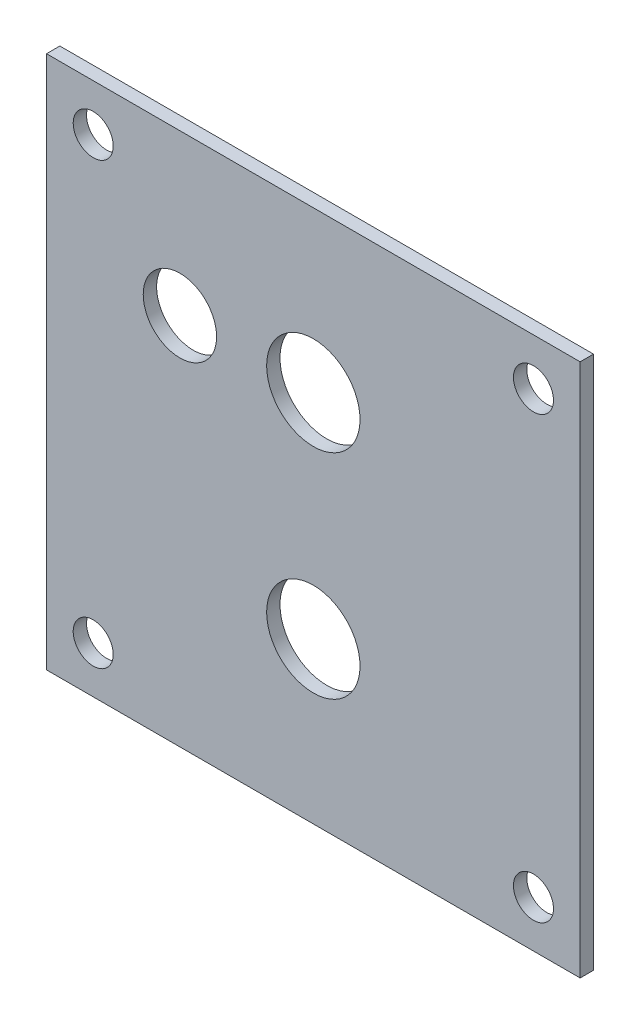
ISO-10303-21;
HEADER;
FILE_DESCRIPTION(('STEP AP214'),'2;1');
FILE_NAME('part.step','',(''),(''),'','','');
FILE_SCHEMA(('AUTOMOTIVE_DESIGN { 1 0 10303 214 1 1 1 1 }'));
ENDSEC;
DATA;
#1=APPLICATION_CONTEXT('core data for automotive mechanical design processes');
#2=APPLICATION_PROTOCOL_DEFINITION('international standard','automotive_design',2000,#1);
#3=PRODUCT_CONTEXT('',#1,'mechanical');
#4=PRODUCT('Part','Part','',(#3));
#5=PRODUCT_RELATED_PRODUCT_CATEGORY('part','',(#4));
#6=PRODUCT_DEFINITION_FORMATION('','',#4);
#7=PRODUCT_DEFINITION_CONTEXT('part definition',#1,'design');
#8=PRODUCT_DEFINITION('design','',#6,#7);
#9=PRODUCT_DEFINITION_SHAPE('','',#8);
#10=(LENGTH_UNIT() NAMED_UNIT(*) SI_UNIT(.MILLI.,.METRE.));
#11=(NAMED_UNIT(*) PLANE_ANGLE_UNIT() SI_UNIT($,.RADIAN.));
#12=(NAMED_UNIT(*) SI_UNIT($,.STERADIAN.) SOLID_ANGLE_UNIT());
#13=UNCERTAINTY_MEASURE_WITH_UNIT(LENGTH_MEASURE(1.E-05),#10,'distance_accuracy_value','');
#14=(GEOMETRIC_REPRESENTATION_CONTEXT(3) GLOBAL_UNCERTAINTY_ASSIGNED_CONTEXT((#13)) GLOBAL_UNIT_ASSIGNED_CONTEXT((#10,
#11,#12)) REPRESENTATION_CONTEXT('',''));
#15=CARTESIAN_POINT('',(0.,0.,0.));
#16=DIRECTION('',(0.,0.,1.));
#17=DIRECTION('',(1.,0.,0.));
#18=AXIS2_PLACEMENT_3D('',#15,#16,#17);
#19=CARTESIAN_POINT('',(63.5,63.5,3.175));
#20=DIRECTION('',(-1.,0.,0.));
#21=DIRECTION('',(0.,-1.,0.));
#22=AXIS2_PLACEMENT_3D('',#19,#20,#21);
#23=PLANE('',#22);
#24=DIRECTION('',(0.,1.,0.));
#25=VECTOR('',#24,1.);
#26=CARTESIAN_POINT('',(63.5,63.5,0.));
#27=LINE('',#26,#25);
#28=CARTESIAN_POINT('',(63.5,-63.5,0.));
#29=VERTEX_POINT('',#28);
#30=CARTESIAN_POINT('',(63.5,63.5,0.));
#31=VERTEX_POINT('',#30);
#32=EDGE_CURVE('E95',#29,#31,#27,.T.);
#33=ORIENTED_EDGE('',*,*,#32,.T.);
#34=DIRECTION('',(0.,0.,-1.));
#35=VECTOR('',#34,1.);
#36=CARTESIAN_POINT('',(63.5,63.5,3.175));
#37=LINE('',#36,#35);
#38=CARTESIAN_POINT('',(63.5,63.5,3.175));
#39=VERTEX_POINT('',#38);
#40=EDGE_CURVE('E11',#39,#31,#37,.T.);
#41=ORIENTED_EDGE('',*,*,#40,.F.);
#42=DIRECTION('',(0.,1.,0.));
#43=VECTOR('',#42,1.);
#44=CARTESIAN_POINT('',(63.5,63.5,3.175));
#45=LINE('',#44,#43);
#46=CARTESIAN_POINT('',(63.5,-63.5,3.175));
#47=VERTEX_POINT('',#46);
#48=EDGE_CURVE('E83',#47,#39,#45,.T.);
#49=ORIENTED_EDGE('',*,*,#48,.F.);
#50=DIRECTION('',(0.,0.,-1.));
#51=VECTOR('',#50,1.);
#52=CARTESIAN_POINT('',(63.5,-63.5,3.175));
#53=LINE('',#52,#51);
#54=EDGE_CURVE('E91',#47,#29,#53,.T.);
#55=ORIENTED_EDGE('',*,*,#54,.T.);
#56=EDGE_LOOP('',(#33,#41,#49,#55));
#57=FACE_BOUND('',#56,.T.);
#58=ADVANCED_FACE('F32',(#57),#23,.F.);
#59=CARTESIAN_POINT('',(-63.5,63.5,3.175));
#60=DIRECTION('',(0.,-1.,0.));
#61=DIRECTION('',(0.,0.,-1.));
#62=AXIS2_PLACEMENT_3D('',#59,#60,#61);
#63=PLANE('',#62);
#64=DIRECTION('',(-1.,0.,0.));
#65=VECTOR('',#64,1.);
#66=CARTESIAN_POINT('',(-63.5,63.5,0.));
#67=LINE('',#66,#65);
#68=CARTESIAN_POINT('',(-63.5,63.5,0.));
#69=VERTEX_POINT('',#68);
#70=EDGE_CURVE('E87',#31,#69,#67,.T.);
#71=ORIENTED_EDGE('',*,*,#70,.T.);
#72=DIRECTION('',(0.,0.,-1.));
#73=VECTOR('',#72,1.);
#74=CARTESIAN_POINT('',(-63.5,63.5,3.175));
#75=LINE('',#74,#73);
#76=CARTESIAN_POINT('',(-63.5,63.5,3.175));
#77=VERTEX_POINT('',#76);
#78=EDGE_CURVE('E40',#77,#69,#75,.T.);
#79=ORIENTED_EDGE('',*,*,#78,.F.);
#80=DIRECTION('',(-1.,0.,0.));
#81=VECTOR('',#80,1.);
#82=CARTESIAN_POINT('',(-63.5,63.5,3.175));
#83=LINE('',#82,#81);
#84=EDGE_CURVE('E78',#39,#77,#83,.T.);
#85=ORIENTED_EDGE('',*,*,#84,.F.);
#86=ORIENTED_EDGE('',*,*,#40,.T.);
#87=EDGE_LOOP('',(#71,#79,#85,#86));
#88=FACE_BOUND('',#87,.T.);
#89=ADVANCED_FACE('F86',(#88),#63,.F.);
#90=CARTESIAN_POINT('',(-63.5,63.5,3.175));
#91=DIRECTION('',(1.,0.,0.));
#92=DIRECTION('',(0.,1.,0.));
#93=AXIS2_PLACEMENT_3D('',#90,#91,#92);
#94=PLANE('',#93);
#95=DIRECTION('',(0.,-1.,0.));
#96=VECTOR('',#95,1.);
#97=CARTESIAN_POINT('',(-63.5,63.5,0.));
#98=LINE('',#97,#96);
#99=CARTESIAN_POINT('',(-63.5,-63.5,0.));
#100=VERTEX_POINT('',#99);
#101=EDGE_CURVE('E65',#69,#100,#98,.T.);
#102=ORIENTED_EDGE('',*,*,#101,.T.);
#103=DIRECTION('',(0.,0.,-1.));
#104=VECTOR('',#103,1.);
#105=CARTESIAN_POINT('',(-63.5,-63.5,3.175));
#106=LINE('',#105,#104);
#107=CARTESIAN_POINT('',(-63.5,-63.5,3.175));
#108=VERTEX_POINT('',#107);
#109=EDGE_CURVE('E88',#108,#100,#106,.T.);
#110=ORIENTED_EDGE('',*,*,#109,.F.);
#111=DIRECTION('',(0.,-1.,0.));
#112=VECTOR('',#111,1.);
#113=CARTESIAN_POINT('',(-63.5,63.5,3.175));
#114=LINE('',#113,#112);
#115=EDGE_CURVE('E81',#77,#108,#114,.T.);
#116=ORIENTED_EDGE('',*,*,#115,.F.);
#117=ORIENTED_EDGE('',*,*,#78,.T.);
#118=EDGE_LOOP('',(#102,#110,#116,#117));
#119=FACE_BOUND('',#118,.T.);
#120=ADVANCED_FACE('F89',(#119),#94,.F.);
#121=CARTESIAN_POINT('',(-63.5,-63.5,3.175));
#122=DIRECTION('',(0.,1.,0.));
#123=DIRECTION('',(0.,0.,1.));
#124=AXIS2_PLACEMENT_3D('',#121,#122,#123);
#125=PLANE('',#124);
#126=DIRECTION('',(1.,0.,0.));
#127=VECTOR('',#126,1.);
#128=CARTESIAN_POINT('',(-63.5,-63.5,0.));
#129=LINE('',#128,#127);
#130=EDGE_CURVE('E71',#100,#29,#129,.T.);
#131=ORIENTED_EDGE('',*,*,#130,.T.);
#132=ORIENTED_EDGE('',*,*,#54,.F.);
#133=DIRECTION('',(1.,0.,0.));
#134=VECTOR('',#133,1.);
#135=CARTESIAN_POINT('',(-63.5,-63.5,3.175));
#136=LINE('',#135,#134);
#137=EDGE_CURVE('E48',#108,#47,#136,.T.);
#138=ORIENTED_EDGE('',*,*,#137,.F.);
#139=ORIENTED_EDGE('',*,*,#109,.T.);
#140=EDGE_LOOP('',(#131,#132,#138,#139));
#141=FACE_BOUND('',#140,.T.);
#142=ADVANCED_FACE('F103',(#141),#125,.F.);
#143=CARTESIAN_POINT('',(0.,0.,3.175));
#144=DIRECTION('',(0.,0.,1.));
#145=DIRECTION('',(1.,0.,0.));
#146=AXIS2_PLACEMENT_3D('',#143,#144,#145);
#147=PLANE('',#146);
#148=CARTESIAN_POINT('',(52.3875,-52.3875,3.175));
#149=DIRECTION('',(0.,0.,1.));
#150=DIRECTION('',(1.,0.,0.));
#151=AXIS2_PLACEMENT_3D('',#148,#149,#150);
#152=CIRCLE('',#151,4.7625);
#153=CARTESIAN_POINT('',(57.15,-52.3875,3.175));
#154=VERTEX_POINT('',#153);
#155=EDGE_CURVE('E144',#154,#154,#152,.F.);
#156=ORIENTED_EDGE('',*,*,#155,.T.);
#157=EDGE_LOOP('',(#156));
#158=FACE_BOUND('',#157,.T.);
#159=CARTESIAN_POINT('',(52.3875,52.3875,3.175));
#160=DIRECTION('',(0.,0.,1.));
#161=DIRECTION('',(1.,0.,0.));
#162=AXIS2_PLACEMENT_3D('',#159,#160,#161);
#163=CIRCLE('',#162,4.7625);
#164=CARTESIAN_POINT('',(57.15,52.3875,3.175));
#165=VERTEX_POINT('',#164);
#166=EDGE_CURVE('E138',#165,#165,#163,.F.);
#167=ORIENTED_EDGE('',*,*,#166,.T.);
#168=EDGE_LOOP('',(#167));
#169=FACE_BOUND('',#168,.T.);
#170=CARTESIAN_POINT('',(-52.3875,-52.3875,3.175));
#171=DIRECTION('',(0.,0.,1.));
#172=DIRECTION('',(1.,0.,0.));
#173=AXIS2_PLACEMENT_3D('',#170,#171,#172);
#174=CIRCLE('',#173,4.7625);
#175=CARTESIAN_POINT('',(-47.625,-52.3875,3.175));
#176=VERTEX_POINT('',#175);
#177=EDGE_CURVE('E132',#176,#176,#174,.F.);
#178=ORIENTED_EDGE('',*,*,#177,.T.);
#179=EDGE_LOOP('',(#178));
#180=FACE_BOUND('',#179,.T.);
#181=CARTESIAN_POINT('',(-52.3875,52.3875,3.175));
#182=DIRECTION('',(0.,0.,1.));
#183=DIRECTION('',(1.,0.,0.));
#184=AXIS2_PLACEMENT_3D('',#181,#182,#183);
#185=CIRCLE('',#184,4.7625);
#186=CARTESIAN_POINT('',(-47.625,52.3875,3.175));
#187=VERTEX_POINT('',#186);
#188=EDGE_CURVE('E126',#187,#187,#185,.F.);
#189=ORIENTED_EDGE('',*,*,#188,.T.);
#190=EDGE_LOOP('',(#189));
#191=FACE_BOUND('',#190,.T.);
#192=CARTESIAN_POINT('',(0.,-25.4,3.175));
#193=DIRECTION('',(0.,0.,1.));
#194=DIRECTION('',(1.,0.,0.));
#195=AXIS2_PLACEMENT_3D('',#192,#193,#194);
#196=CIRCLE('',#195,11.1125);
#197=CARTESIAN_POINT('',(11.1125,-25.4,3.175));
#198=VERTEX_POINT('',#197);
#199=EDGE_CURVE('E120',#198,#198,#196,.F.);
#200=ORIENTED_EDGE('',*,*,#199,.T.);
#201=EDGE_LOOP('',(#200));
#202=FACE_BOUND('',#201,.T.);
#203=CARTESIAN_POINT('',(-31.75,25.4,3.175));
#204=DIRECTION('',(0.,0.,1.));
#205=DIRECTION('',(1.,0.,0.));
#206=AXIS2_PLACEMENT_3D('',#203,#204,#205);
#207=CIRCLE('',#206,8.73124999999999);
#208=CARTESIAN_POINT('',(-23.01875,25.4,3.175));
#209=VERTEX_POINT('',#208);
#210=EDGE_CURVE('E114',#209,#209,#207,.F.);
#211=ORIENTED_EDGE('',*,*,#210,.T.);
#212=EDGE_LOOP('',(#211));
#213=FACE_BOUND('',#212,.T.);
#214=CARTESIAN_POINT('',(0.,25.4,3.175));
#215=DIRECTION('',(0.,0.,1.));
#216=DIRECTION('',(1.,0.,0.));
#217=AXIS2_PLACEMENT_3D('',#214,#215,#216);
#218=CIRCLE('',#217,11.1125);
#219=CARTESIAN_POINT('',(11.1125,25.4,3.175));
#220=VERTEX_POINT('',#219);
#221=EDGE_CURVE('E98',#220,#220,#218,.F.);
#222=ORIENTED_EDGE('',*,*,#221,.T.);
#223=EDGE_LOOP('',(#222));
#224=FACE_BOUND('',#223,.T.);
#225=ORIENTED_EDGE('',*,*,#48,.T.);
#226=ORIENTED_EDGE('',*,*,#84,.T.);
#227=ORIENTED_EDGE('',*,*,#115,.T.);
#228=ORIENTED_EDGE('',*,*,#137,.T.);
#229=EDGE_LOOP('',(#225,#226,#227,#228));
#230=FACE_BOUND('',#229,.T.);
#231=ADVANCED_FACE('F79',(#158,#169,#180,#191,#202,#213,#224,#230),#147,.T.);
#232=CARTESIAN_POINT('',(0.,0.,0.));
#233=DIRECTION('',(0.,0.,1.));
#234=DIRECTION('',(1.,0.,0.));
#235=AXIS2_PLACEMENT_3D('',#232,#233,#234);
#236=PLANE('',#235);
#237=CARTESIAN_POINT('',(52.3875,-52.3875,0.));
#238=DIRECTION('',(0.,0.,-1.));
#239=DIRECTION('',(-1.,0.,0.));
#240=AXIS2_PLACEMENT_3D('',#237,#238,#239);
#241=CIRCLE('',#240,4.7625);
#242=CARTESIAN_POINT('',(47.625,-52.3875,0.));
#243=VERTEX_POINT('',#242);
#244=EDGE_CURVE('E147',#243,#243,#241,.T.);
#245=ORIENTED_EDGE('',*,*,#244,.F.);
#246=EDGE_LOOP('',(#245));
#247=FACE_BOUND('',#246,.T.);
#248=CARTESIAN_POINT('',(52.3875,52.3875,0.));
#249=DIRECTION('',(0.,0.,-1.));
#250=DIRECTION('',(1.,0.,0.));
#251=AXIS2_PLACEMENT_3D('',#248,#249,#250);
#252=CIRCLE('',#251,4.7625);
#253=CARTESIAN_POINT('',(57.15,52.3875,0.));
#254=VERTEX_POINT('',#253);
#255=EDGE_CURVE('E141',#254,#254,#252,.T.);
#256=ORIENTED_EDGE('',*,*,#255,.F.);
#257=EDGE_LOOP('',(#256));
#258=FACE_BOUND('',#257,.T.);
#259=CARTESIAN_POINT('',(-52.3875,-52.3875,0.));
#260=DIRECTION('',(0.,0.,-1.));
#261=DIRECTION('',(1.,0.,0.));
#262=AXIS2_PLACEMENT_3D('',#259,#260,#261);
#263=CIRCLE('',#262,4.7625);
#264=CARTESIAN_POINT('',(-47.625,-52.3875,0.));
#265=VERTEX_POINT('',#264);
#266=EDGE_CURVE('E135',#265,#265,#263,.T.);
#267=ORIENTED_EDGE('',*,*,#266,.F.);
#268=EDGE_LOOP('',(#267));
#269=FACE_BOUND('',#268,.T.);
#270=CARTESIAN_POINT('',(-52.3875,52.3875,0.));
#271=DIRECTION('',(0.,0.,-1.));
#272=DIRECTION('',(-1.,0.,0.));
#273=AXIS2_PLACEMENT_3D('',#270,#271,#272);
#274=CIRCLE('',#273,4.7625);
#275=CARTESIAN_POINT('',(-57.15,52.3875,0.));
#276=VERTEX_POINT('',#275);
#277=EDGE_CURVE('E129',#276,#276,#274,.T.);
#278=ORIENTED_EDGE('',*,*,#277,.F.);
#279=EDGE_LOOP('',(#278));
#280=FACE_BOUND('',#279,.T.);
#281=CARTESIAN_POINT('',(0.,-25.4,0.));
#282=DIRECTION('',(0.,0.,-1.));
#283=DIRECTION('',(-1.,0.,0.));
#284=AXIS2_PLACEMENT_3D('',#281,#282,#283);
#285=CIRCLE('',#284,11.1125);
#286=CARTESIAN_POINT('',(-11.1125,-25.4,0.));
#287=VERTEX_POINT('',#286);
#288=EDGE_CURVE('E123',#287,#287,#285,.T.);
#289=ORIENTED_EDGE('',*,*,#288,.F.);
#290=EDGE_LOOP('',(#289));
#291=FACE_BOUND('',#290,.T.);
#292=CARTESIAN_POINT('',(-31.75,25.4,0.));
#293=DIRECTION('',(0.,0.,-1.));
#294=DIRECTION('',(-1.,0.,0.));
#295=AXIS2_PLACEMENT_3D('',#292,#293,#294);
#296=CIRCLE('',#295,8.73124999999999);
#297=CARTESIAN_POINT('',(-40.48125,25.4,0.));
#298=VERTEX_POINT('',#297);
#299=EDGE_CURVE('E117',#298,#298,#296,.T.);
#300=ORIENTED_EDGE('',*,*,#299,.F.);
#301=EDGE_LOOP('',(#300));
#302=FACE_BOUND('',#301,.T.);
#303=CARTESIAN_POINT('',(0.,25.4,0.));
#304=DIRECTION('',(0.,0.,-1.));
#305=DIRECTION('',(-1.,0.,0.));
#306=AXIS2_PLACEMENT_3D('',#303,#304,#305);
#307=CIRCLE('',#306,11.1125);
#308=CARTESIAN_POINT('',(-11.1125,25.4,0.));
#309=VERTEX_POINT('',#308);
#310=EDGE_CURVE('E111',#309,#309,#307,.T.);
#311=ORIENTED_EDGE('',*,*,#310,.F.);
#312=EDGE_LOOP('',(#311));
#313=FACE_BOUND('',#312,.T.);
#314=ORIENTED_EDGE('',*,*,#32,.F.);
#315=ORIENTED_EDGE('',*,*,#130,.F.);
#316=ORIENTED_EDGE('',*,*,#101,.F.);
#317=ORIENTED_EDGE('',*,*,#70,.F.);
#318=EDGE_LOOP('',(#314,#315,#316,#317));
#319=FACE_BOUND('',#318,.T.);
#320=ADVANCED_FACE('F106',(#247,#258,#269,#280,#291,#302,#313,#319),#236,.F.);
#321=CARTESIAN_POINT('',(0.,25.4,34.605896423742));
#322=DIRECTION('',(0.,0.,-1.));
#323=DIRECTION('',(-1.,0.,0.));
#324=AXIS2_PLACEMENT_3D('',#321,#322,#323);
#325=CYLINDRICAL_SURFACE('',#324,11.1125);
#326=ORIENTED_EDGE('',*,*,#310,.T.);
#327=EDGE_LOOP('',(#326));
#328=FACE_BOUND('',#327,.T.);
#329=ORIENTED_EDGE('',*,*,#221,.F.);
#330=EDGE_LOOP('',(#329));
#331=FACE_BOUND('',#330,.T.);
#332=ADVANCED_FACE('F156',(#328,#331),#325,.F.);
#333=CARTESIAN_POINT('',(-31.75,25.4,34.605896423742));
#334=DIRECTION('',(0.,0.,-1.));
#335=DIRECTION('',(-1.,0.,0.));
#336=AXIS2_PLACEMENT_3D('',#333,#334,#335);
#337=CYLINDRICAL_SURFACE('',#336,8.73124999999999);
#338=ORIENTED_EDGE('',*,*,#299,.T.);
#339=EDGE_LOOP('',(#338));
#340=FACE_BOUND('',#339,.T.);
#341=ORIENTED_EDGE('',*,*,#210,.F.);
#342=EDGE_LOOP('',(#341));
#343=FACE_BOUND('',#342,.T.);
#344=ADVANCED_FACE('F172',(#340,#343),#337,.F.);
#345=CARTESIAN_POINT('',(0.,-25.4,34.605896423742));
#346=DIRECTION('',(0.,0.,-1.));
#347=DIRECTION('',(-1.,0.,0.));
#348=AXIS2_PLACEMENT_3D('',#345,#346,#347);
#349=CYLINDRICAL_SURFACE('',#348,11.1125);
#350=ORIENTED_EDGE('',*,*,#288,.T.);
#351=EDGE_LOOP('',(#350));
#352=FACE_BOUND('',#351,.T.);
#353=ORIENTED_EDGE('',*,*,#199,.F.);
#354=EDGE_LOOP('',(#353));
#355=FACE_BOUND('',#354,.T.);
#356=ADVANCED_FACE('F215',(#352,#355),#349,.F.);
#357=CARTESIAN_POINT('',(-52.3875,52.3875,16.6453841816037));
#358=DIRECTION('',(0.,0.,-1.));
#359=DIRECTION('',(-1.,0.,0.));
#360=AXIS2_PLACEMENT_3D('',#357,#358,#359);
#361=CYLINDRICAL_SURFACE('',#360,4.7625);
#362=ORIENTED_EDGE('',*,*,#277,.T.);
#363=EDGE_LOOP('',(#362));
#364=FACE_BOUND('',#363,.T.);
#365=ORIENTED_EDGE('',*,*,#188,.F.);
#366=EDGE_LOOP('',(#365));
#367=FACE_BOUND('',#366,.T.);
#368=ADVANCED_FACE('F224',(#364,#367),#361,.F.);
#369=CARTESIAN_POINT('',(-52.3875,-52.3875,16.6453841816037));
#370=DIRECTION('',(0.,0.,-1.));
#371=DIRECTION('',(-1.,0.,0.));
#372=AXIS2_PLACEMENT_3D('',#369,#370,#371);
#373=CYLINDRICAL_SURFACE('',#372,4.7625);
#374=ORIENTED_EDGE('',*,*,#266,.T.);
#375=EDGE_LOOP('',(#374));
#376=FACE_BOUND('',#375,.T.);
#377=ORIENTED_EDGE('',*,*,#177,.F.);
#378=EDGE_LOOP('',(#377));
#379=FACE_BOUND('',#378,.T.);
#380=ADVANCED_FACE('F243',(#376,#379),#373,.F.);
#381=CARTESIAN_POINT('',(52.3875,52.3875,16.6453841816037));
#382=DIRECTION('',(0.,0.,-1.));
#383=DIRECTION('',(-1.,0.,0.));
#384=AXIS2_PLACEMENT_3D('',#381,#382,#383);
#385=CYLINDRICAL_SURFACE('',#384,4.7625);
#386=ORIENTED_EDGE('',*,*,#255,.T.);
#387=EDGE_LOOP('',(#386));
#388=FACE_BOUND('',#387,.T.);
#389=ORIENTED_EDGE('',*,*,#166,.F.);
#390=EDGE_LOOP('',(#389));
#391=FACE_BOUND('',#390,.T.);
#392=ADVANCED_FACE('F253',(#388,#391),#385,.F.);
#393=CARTESIAN_POINT('',(52.3875,-52.3875,16.6453841816037));
#394=DIRECTION('',(0.,0.,-1.));
#395=DIRECTION('',(-1.,0.,0.));
#396=AXIS2_PLACEMENT_3D('',#393,#394,#395);
#397=CYLINDRICAL_SURFACE('',#396,4.7625);
#398=ORIENTED_EDGE('',*,*,#244,.T.);
#399=EDGE_LOOP('',(#398));
#400=FACE_BOUND('',#399,.T.);
#401=ORIENTED_EDGE('',*,*,#155,.F.);
#402=EDGE_LOOP('',(#401));
#403=FACE_BOUND('',#402,.T.);
#404=ADVANCED_FACE('F151',(#400,#403),#397,.F.);
#405=CLOSED_SHELL('',(#58,#89,#120,#142,#231,#320,#332,#344,#356,#368,#380,#392,#404));
#406=MANIFOLD_SOLID_BREP('B2',#405);
#407=ADVANCED_BREP_SHAPE_REPRESENTATION('',(#18,#406),#14);
#408=SHAPE_DEFINITION_REPRESENTATION(#9,#407);
ENDSEC;
END-ISO-10303-21;
